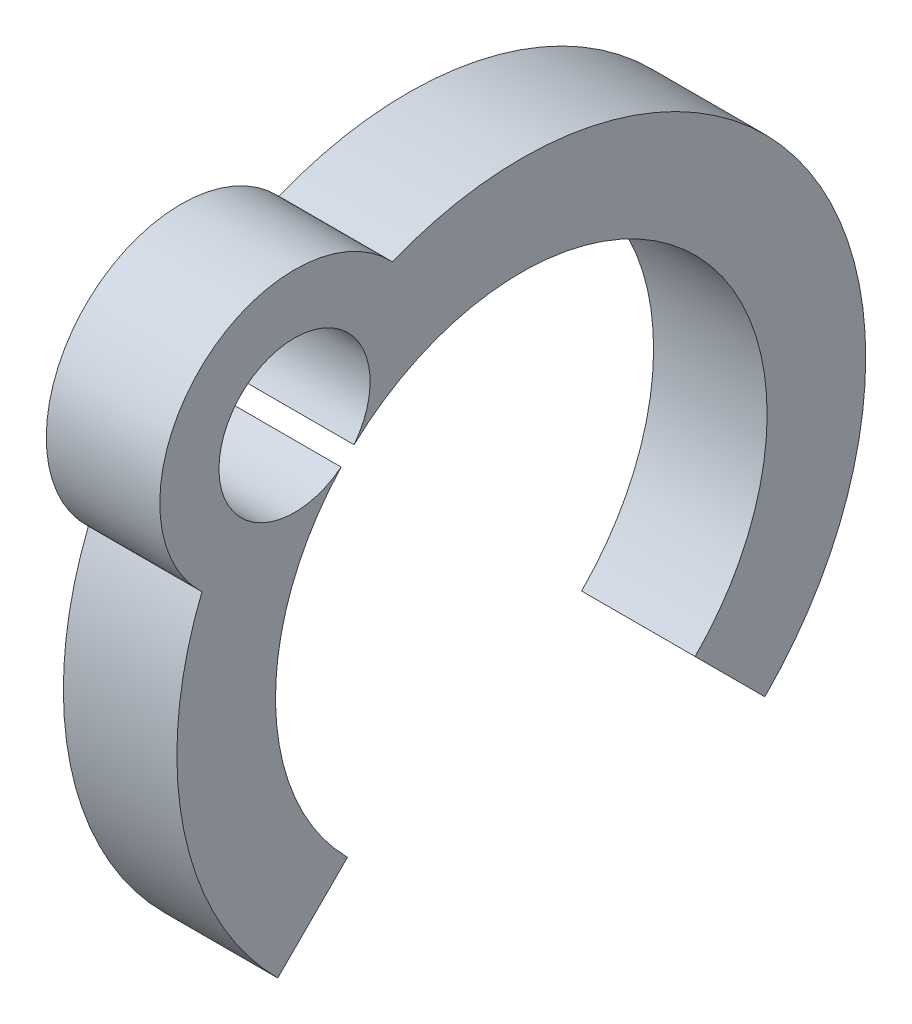
ISO-10303-21;
HEADER;
FILE_DESCRIPTION(('STEP AP214'),'2;1');
FILE_NAME('part.step','',(''),(''),'','','');
FILE_SCHEMA(('AUTOMOTIVE_DESIGN { 1 0 10303 214 1 1 1 1 }'));
ENDSEC;
DATA;
#1=APPLICATION_CONTEXT('core data for automotive mechanical design processes');
#2=APPLICATION_PROTOCOL_DEFINITION('international standard','automotive_design',2000,#1);
#3=PRODUCT_CONTEXT('',#1,'mechanical');
#4=PRODUCT('Part','Part','',(#3));
#5=PRODUCT_RELATED_PRODUCT_CATEGORY('part','',(#4));
#6=PRODUCT_DEFINITION_FORMATION('','',#4);
#7=PRODUCT_DEFINITION_CONTEXT('part definition',#1,'design');
#8=PRODUCT_DEFINITION('design','',#6,#7);
#9=PRODUCT_DEFINITION_SHAPE('','',#8);
#10=(LENGTH_UNIT() NAMED_UNIT(*) SI_UNIT(.MILLI.,.METRE.));
#11=(NAMED_UNIT(*) PLANE_ANGLE_UNIT() SI_UNIT($,.RADIAN.));
#12=(NAMED_UNIT(*) SI_UNIT($,.STERADIAN.) SOLID_ANGLE_UNIT());
#13=UNCERTAINTY_MEASURE_WITH_UNIT(LENGTH_MEASURE(1.E-05),#10,'distance_accuracy_value','');
#14=(GEOMETRIC_REPRESENTATION_CONTEXT(3) GLOBAL_UNCERTAINTY_ASSIGNED_CONTEXT((#13)) GLOBAL_UNIT_ASSIGNED_CONTEXT((#10,
#11,#12)) REPRESENTATION_CONTEXT('',''));
#15=CARTESIAN_POINT('',(0.,0.,0.));
#16=DIRECTION('',(0.,0.,1.));
#17=DIRECTION('',(1.,0.,0.));
#18=AXIS2_PLACEMENT_3D('',#15,#16,#17);
#19=CARTESIAN_POINT('',(1.7272,3.44999999999999,3.45));
#20=DIRECTION('',(-1.,0.,0.));
#21=DIRECTION('',(0.,0.,1.));
#22=AXIS2_PLACEMENT_3D('',#19,#20,#21);
#23=CYLINDRICAL_SURFACE('',#22,1.15);
#24=CARTESIAN_POINT('',(0.,3.44999999999999,3.45));
#25=DIRECTION('',(1.,0.,0.));
#26=DIRECTION('',(0.,0.,-1.));
#27=AXIS2_PLACEMENT_3D('',#24,#25,#26);
#28=CIRCLE('',#27,1.15);
#29=CARTESIAN_POINT('',(0.,2.74081690606936,2.54470483306107));
#30=VERTEX_POINT('',#29);
#31=CARTESIAN_POINT('',(0.,2.54470483306106,2.74081690606937));
#32=VERTEX_POINT('',#31);
#33=EDGE_CURVE('E131',#30,#32,#28,.T.);
#34=ORIENTED_EDGE('',*,*,#33,.F.);
#35=DIRECTION('',(-1.,0.,0.));
#36=VECTOR('',#35,1.);
#37=CARTESIAN_POINT('',(1.7272,2.74081690606936,2.54470483306107));
#38=LINE('',#37,#36);
#39=CARTESIAN_POINT('',(1.7272,2.74081690606936,2.54470483306107));
#40=VERTEX_POINT('',#39);
#41=EDGE_CURVE('E11',#40,#30,#38,.T.);
#42=ORIENTED_EDGE('',*,*,#41,.F.);
#43=CARTESIAN_POINT('',(1.7272,3.44999999999999,3.45));
#44=DIRECTION('',(1.,0.,0.));
#45=DIRECTION('',(0.,0.,-1.));
#46=AXIS2_PLACEMENT_3D('',#43,#44,#45);
#47=CIRCLE('',#46,1.15);
#48=CARTESIAN_POINT('',(1.7272,2.54470483306106,2.74081690606937));
#49=VERTEX_POINT('',#48);
#50=EDGE_CURVE('E151',#40,#49,#47,.T.);
#51=ORIENTED_EDGE('',*,*,#50,.T.);
#52=DIRECTION('',(-1.,0.,0.));
#53=VECTOR('',#52,1.);
#54=CARTESIAN_POINT('',(1.7272,2.54470483306106,2.74081690606937));
#55=LINE('',#54,#53);
#56=EDGE_CURVE('E87',#49,#32,#55,.T.);
#57=ORIENTED_EDGE('',*,*,#56,.T.);
#58=EDGE_LOOP('',(#34,#42,#51,#57));
#59=FACE_BOUND('',#58,.T.);
#60=ADVANCED_FACE('F37',(#59),#23,.F.);
#61=CARTESIAN_POINT('',(1.7272,0.,0.));
#62=DIRECTION('',(-1.,0.,0.));
#63=DIRECTION('',(0.,0.,1.));
#64=AXIS2_PLACEMENT_3D('',#61,#62,#63);
#65=CYLINDRICAL_SURFACE('',#64,3.74);
#66=CARTESIAN_POINT('',(0.,0.,0.));
#67=DIRECTION('',(1.,0.,0.));
#68=DIRECTION('',(0.,0.,-1.));
#69=AXIS2_PLACEMENT_3D('',#66,#67,#68);
#70=CIRCLE('',#69,3.74);
#71=CARTESIAN_POINT('',(0.,-2.64457936163768,-2.64457936163769));
#72=VERTEX_POINT('',#71);
#73=EDGE_CURVE('E134',#30,#72,#70,.F.);
#74=ORIENTED_EDGE('',*,*,#73,.T.);
#75=DIRECTION('',(-1.,0.,0.));
#76=VECTOR('',#75,1.);
#77=CARTESIAN_POINT('',(1.7272,-2.64457936163768,-2.64457936163769));
#78=LINE('',#77,#76);
#79=CARTESIAN_POINT('',(1.7272,-2.64457936163768,-2.64457936163769));
#80=VERTEX_POINT('',#79);
#81=EDGE_CURVE('E45',#80,#72,#78,.T.);
#82=ORIENTED_EDGE('',*,*,#81,.F.);
#83=CARTESIAN_POINT('',(1.7272,0.,0.));
#84=DIRECTION('',(1.,0.,0.));
#85=DIRECTION('',(0.,0.,-1.));
#86=AXIS2_PLACEMENT_3D('',#83,#84,#85);
#87=CIRCLE('',#86,3.74);
#88=EDGE_CURVE('E176',#40,#80,#87,.F.);
#89=ORIENTED_EDGE('',*,*,#88,.F.);
#90=ORIENTED_EDGE('',*,*,#41,.T.);
#91=EDGE_LOOP('',(#74,#82,#89,#90));
#92=FACE_BOUND('',#91,.T.);
#93=ADVANCED_FACE('F167',(#92),#65,.F.);
#94=CARTESIAN_POINT('',(1.7272,-5.0598160525485,-5.05981605254851));
#95=DIRECTION('',(0.,-0.707106781186548,0.707106781186547));
#96=DIRECTION('',(0.,-0.707106781186547,-0.707106781186548));
#97=AXIS2_PLACEMENT_3D('',#94,#95,#96);
#98=PLANE('',#97);
#99=DIRECTION('',(0.,0.707106781186547,0.707106781186548));
#100=VECTOR('',#99,1.);
#101=CARTESIAN_POINT('',(0.,-5.0598160525485,-5.05981605254851));
#102=LINE('',#101,#100);
#103=CARTESIAN_POINT('',(0.,-3.7052395334175,-3.70523953341751));
#104=VERTEX_POINT('',#103);
#105=EDGE_CURVE('E137',#104,#72,#102,.T.);
#106=ORIENTED_EDGE('',*,*,#105,.F.);
#107=DIRECTION('',(-1.,0.,0.));
#108=VECTOR('',#107,1.);
#109=CARTESIAN_POINT('',(1.7272,-3.7052395334175,-3.70523953341751));
#110=LINE('',#109,#108);
#111=CARTESIAN_POINT('',(1.7272,-3.7052395334175,-3.70523953341751));
#112=VERTEX_POINT('',#111);
#113=EDGE_CURVE('E157',#112,#104,#110,.T.);
#114=ORIENTED_EDGE('',*,*,#113,.F.);
#115=DIRECTION('',(0.,0.707106781186547,0.707106781186548));
#116=VECTOR('',#115,1.);
#117=CARTESIAN_POINT('',(1.7272,-5.0598160525485,-5.05981605254851));
#118=LINE('',#117,#116);
#119=EDGE_CURVE('E164',#112,#80,#118,.T.);
#120=ORIENTED_EDGE('',*,*,#119,.T.);
#121=ORIENTED_EDGE('',*,*,#81,.T.);
#122=EDGE_LOOP('',(#106,#114,#120,#121));
#123=FACE_BOUND('',#122,.T.);
#124=ADVANCED_FACE('F162',(#123),#98,.T.);
#125=CARTESIAN_POINT('',(1.7272,0.,0.));
#126=DIRECTION('',(-1.,0.,0.));
#127=DIRECTION('',(0.,0.,1.));
#128=AXIS2_PLACEMENT_3D('',#125,#126,#127);
#129=CYLINDRICAL_SURFACE('',#128,5.24);
#130=CARTESIAN_POINT('',(0.,0.,0.));
#131=DIRECTION('',(1.,0.,0.));
#132=DIRECTION('',(0.,0.,-1.));
#133=AXIS2_PLACEMENT_3D('',#130,#131,#132);
#134=CIRCLE('',#133,5.24);
#135=CARTESIAN_POINT('',(0.,4.85917327477946,1.96113107304663));
#136=VERTEX_POINT('',#135);
#137=EDGE_CURVE('E140',#136,#104,#134,.F.);
#138=ORIENTED_EDGE('',*,*,#137,.F.);
#139=DIRECTION('',(-1.,0.,0.));
#140=VECTOR('',#139,1.);
#141=CARTESIAN_POINT('',(1.7272,4.85917327477946,1.96113107304663));
#142=LINE('',#141,#140);
#143=CARTESIAN_POINT('',(1.7272,4.85917327477946,1.96113107304663));
#144=VERTEX_POINT('',#143);
#145=EDGE_CURVE('E155',#144,#136,#142,.T.);
#146=ORIENTED_EDGE('',*,*,#145,.F.);
#147=CARTESIAN_POINT('',(1.7272,0.,0.));
#148=DIRECTION('',(1.,0.,0.));
#149=DIRECTION('',(0.,0.,-1.));
#150=AXIS2_PLACEMENT_3D('',#147,#148,#149);
#151=CIRCLE('',#150,5.24);
#152=EDGE_CURVE('E175',#144,#112,#151,.F.);
#153=ORIENTED_EDGE('',*,*,#152,.T.);
#154=ORIENTED_EDGE('',*,*,#113,.T.);
#155=EDGE_LOOP('',(#138,#146,#153,#154));
#156=FACE_BOUND('',#155,.T.);
#157=ADVANCED_FACE('F173',(#156),#129,.T.);
#158=CARTESIAN_POINT('',(1.7272,3.44999999999999,3.45));
#159=DIRECTION('',(-1.,0.,0.));
#160=DIRECTION('',(0.,0.,1.));
#161=AXIS2_PLACEMENT_3D('',#158,#159,#160);
#162=CYLINDRICAL_SURFACE('',#161,2.05);
#163=CARTESIAN_POINT('',(0.,3.44999999999999,3.45));
#164=DIRECTION('',(1.,0.,0.));
#165=DIRECTION('',(0.,0.,-1.));
#166=AXIS2_PLACEMENT_3D('',#163,#164,#165);
#167=CIRCLE('',#166,2.05);
#168=CARTESIAN_POINT('',(0.,1.96113107304661,4.85917327477947));
#169=VERTEX_POINT('',#168);
#170=EDGE_CURVE('E143',#136,#169,#167,.T.);
#171=ORIENTED_EDGE('',*,*,#170,.T.);
#172=DIRECTION('',(-1.,0.,0.));
#173=VECTOR('',#172,1.);
#174=CARTESIAN_POINT('',(1.7272,1.96113107304661,4.85917327477947));
#175=LINE('',#174,#173);
#176=CARTESIAN_POINT('',(1.7272,1.96113107304661,4.85917327477947));
#177=VERTEX_POINT('',#176);
#178=EDGE_CURVE('E117',#177,#169,#175,.T.);
#179=ORIENTED_EDGE('',*,*,#178,.F.);
#180=CARTESIAN_POINT('',(1.7272,3.44999999999999,3.45));
#181=DIRECTION('',(1.,0.,0.));
#182=DIRECTION('',(0.,0.,-1.));
#183=AXIS2_PLACEMENT_3D('',#180,#181,#182);
#184=CIRCLE('',#183,2.05);
#185=EDGE_CURVE('E123',#144,#177,#184,.T.);
#186=ORIENTED_EDGE('',*,*,#185,.F.);
#187=ORIENTED_EDGE('',*,*,#145,.T.);
#188=EDGE_LOOP('',(#171,#179,#186,#187));
#189=FACE_BOUND('',#188,.T.);
#190=ADVANCED_FACE('F192',(#189),#162,.T.);
#191=CARTESIAN_POINT('',(1.7272,0.,0.));
#192=DIRECTION('',(-1.,0.,0.));
#193=DIRECTION('',(0.,0.,1.));
#194=AXIS2_PLACEMENT_3D('',#191,#192,#193);
#195=CYLINDRICAL_SURFACE('',#194,5.24);
#196=CARTESIAN_POINT('',(0.,0.,0.));
#197=DIRECTION('',(1.,0.,0.));
#198=DIRECTION('',(0.,0.,-1.));
#199=AXIS2_PLACEMENT_3D('',#196,#197,#198);
#200=CIRCLE('',#199,5.24);
#201=CARTESIAN_POINT('',(0.,-3.70523953341749,3.70523953341752));
#202=VERTEX_POINT('',#201);
#203=EDGE_CURVE('E112',#202,#169,#200,.F.);
#204=ORIENTED_EDGE('',*,*,#203,.F.);
#205=DIRECTION('',(-1.,0.,0.));
#206=VECTOR('',#205,1.);
#207=CARTESIAN_POINT('',(1.7272,-3.70523953341749,3.70523953341752));
#208=LINE('',#207,#206);
#209=CARTESIAN_POINT('',(1.7272,-3.70523953341749,3.70523953341752));
#210=VERTEX_POINT('',#209);
#211=EDGE_CURVE('E107',#210,#202,#208,.T.);
#212=ORIENTED_EDGE('',*,*,#211,.F.);
#213=CARTESIAN_POINT('',(1.7272,0.,0.));
#214=DIRECTION('',(1.,0.,0.));
#215=DIRECTION('',(0.,0.,-1.));
#216=AXIS2_PLACEMENT_3D('',#213,#214,#215);
#217=CIRCLE('',#216,5.24);
#218=EDGE_CURVE('E110',#210,#177,#217,.F.);
#219=ORIENTED_EDGE('',*,*,#218,.T.);
#220=ORIENTED_EDGE('',*,*,#178,.T.);
#221=EDGE_LOOP('',(#204,#212,#219,#220));
#222=FACE_BOUND('',#221,.T.);
#223=ADVANCED_FACE('F109',(#222),#195,.T.);
#224=CARTESIAN_POINT('',(1.7272,5.94452920040787,-5.94452920040796));
#225=DIRECTION('',(0.,-0.707106781186552,-0.707106781186543));
#226=DIRECTION('',(0.,0.707106781186543,-0.707106781186552));
#227=AXIS2_PLACEMENT_3D('',#224,#225,#226);
#228=PLANE('',#227);
#229=DIRECTION('',(0.,-0.707106781186543,0.707106781186552));
#230=VECTOR('',#229,1.);
#231=CARTESIAN_POINT('',(0.,5.94452920040787,-5.94452920040796));
#232=LINE('',#231,#230);
#233=CARTESIAN_POINT('',(0.,-2.64457936163768,2.6445793616377));
#234=VERTEX_POINT('',#233);
#235=EDGE_CURVE('E147',#234,#202,#232,.T.);
#236=ORIENTED_EDGE('',*,*,#235,.F.);
#237=DIRECTION('',(-1.,0.,0.));
#238=VECTOR('',#237,1.);
#239=CARTESIAN_POINT('',(1.7272,-2.64457936163768,2.6445793616377));
#240=LINE('',#239,#238);
#241=CARTESIAN_POINT('',(1.7272,-2.64457936163768,2.6445793616377));
#242=VERTEX_POINT('',#241);
#243=EDGE_CURVE('E80',#242,#234,#240,.T.);
#244=ORIENTED_EDGE('',*,*,#243,.F.);
#245=DIRECTION('',(0.,-0.707106781186543,0.707106781186552));
#246=VECTOR('',#245,1.);
#247=CARTESIAN_POINT('',(1.7272,5.94452920040787,-5.94452920040796));
#248=LINE('',#247,#246);
#249=EDGE_CURVE('E120',#242,#210,#248,.T.);
#250=ORIENTED_EDGE('',*,*,#249,.T.);
#251=ORIENTED_EDGE('',*,*,#211,.T.);
#252=EDGE_LOOP('',(#236,#244,#250,#251));
#253=FACE_BOUND('',#252,.T.);
#254=ADVANCED_FACE('F126',(#253),#228,.T.);
#255=CARTESIAN_POINT('',(1.7272,0.,0.));
#256=DIRECTION('',(-1.,0.,0.));
#257=DIRECTION('',(0.,0.,1.));
#258=AXIS2_PLACEMENT_3D('',#255,#256,#257);
#259=CYLINDRICAL_SURFACE('',#258,3.74);
#260=CARTESIAN_POINT('',(0.,0.,0.));
#261=DIRECTION('',(1.,0.,0.));
#262=DIRECTION('',(0.,0.,-1.));
#263=AXIS2_PLACEMENT_3D('',#260,#261,#262);
#264=CIRCLE('',#263,3.74);
#265=EDGE_CURVE('E149',#234,#32,#264,.F.);
#266=ORIENTED_EDGE('',*,*,#265,.T.);
#267=ORIENTED_EDGE('',*,*,#56,.F.);
#268=CARTESIAN_POINT('',(1.7272,0.,0.));
#269=DIRECTION('',(1.,0.,0.));
#270=DIRECTION('',(0.,0.,-1.));
#271=AXIS2_PLACEMENT_3D('',#268,#269,#270);
#272=CIRCLE('',#271,3.74);
#273=EDGE_CURVE('E53',#242,#49,#272,.F.);
#274=ORIENTED_EDGE('',*,*,#273,.F.);
#275=ORIENTED_EDGE('',*,*,#243,.T.);
#276=EDGE_LOOP('',(#266,#267,#274,#275));
#277=FACE_BOUND('',#276,.T.);
#278=ADVANCED_FACE('F200',(#277),#259,.F.);
#279=CARTESIAN_POINT('',(1.7272,0.884713147859381,-11.0043452529564));
#280=DIRECTION('',(1.,0.,0.));
#281=DIRECTION('',(0.,0.,-1.));
#282=AXIS2_PLACEMENT_3D('',#279,#280,#281);
#283=PLANE('',#282);
#284=ORIENTED_EDGE('',*,*,#50,.F.);
#285=ORIENTED_EDGE('',*,*,#88,.T.);
#286=ORIENTED_EDGE('',*,*,#119,.F.);
#287=ORIENTED_EDGE('',*,*,#152,.F.);
#288=ORIENTED_EDGE('',*,*,#185,.T.);
#289=ORIENTED_EDGE('',*,*,#218,.F.);
#290=ORIENTED_EDGE('',*,*,#249,.F.);
#291=ORIENTED_EDGE('',*,*,#273,.T.);
#292=EDGE_LOOP('',(#284,#285,#286,#287,#288,#289,#290,#291));
#293=FACE_BOUND('',#292,.T.);
#294=ADVANCED_FACE('F119',(#293),#283,.T.);
#295=CARTESIAN_POINT('',(0.,0.884713147859381,-11.0043452529564));
#296=DIRECTION('',(1.,0.,0.));
#297=DIRECTION('',(0.,0.,-1.));
#298=AXIS2_PLACEMENT_3D('',#295,#296,#297);
#299=PLANE('',#298);
#300=ORIENTED_EDGE('',*,*,#33,.T.);
#301=ORIENTED_EDGE('',*,*,#265,.F.);
#302=ORIENTED_EDGE('',*,*,#235,.T.);
#303=ORIENTED_EDGE('',*,*,#203,.T.);
#304=ORIENTED_EDGE('',*,*,#170,.F.);
#305=ORIENTED_EDGE('',*,*,#137,.T.);
#306=ORIENTED_EDGE('',*,*,#105,.T.);
#307=ORIENTED_EDGE('',*,*,#73,.F.);
#308=EDGE_LOOP('',(#300,#301,#302,#303,#304,#305,#306,#307));
#309=FACE_BOUND('',#308,.T.);
#310=ADVANCED_FACE('F169',(#309),#299,.F.);
#311=CLOSED_SHELL('',(#60,#93,#124,#157,#190,#223,#254,#278,#294,#310));
#312=MANIFOLD_SOLID_BREP('B2',#311);
#313=ADVANCED_BREP_SHAPE_REPRESENTATION('',(#18,#312),#14);
#314=SHAPE_DEFINITION_REPRESENTATION(#9,#313);
ENDSEC;
END-ISO-10303-21;
